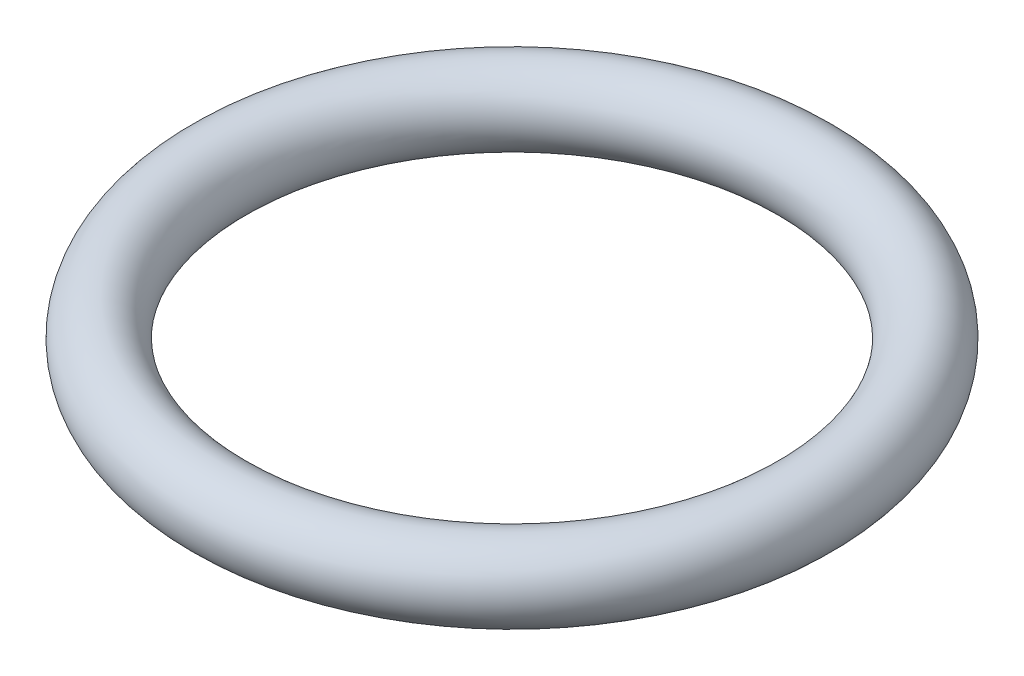
ISO-10303-21;
HEADER;
FILE_DESCRIPTION(('STEP AP214'),'2;1');
FILE_NAME('part.step','',(''),(''),'','','');
FILE_SCHEMA(('AUTOMOTIVE_DESIGN { 1 0 10303 214 1 1 1 1 }'));
ENDSEC;
DATA;
#1=APPLICATION_CONTEXT('core data for automotive mechanical design processes');
#2=APPLICATION_PROTOCOL_DEFINITION('international standard','automotive_design',2000,#1);
#3=PRODUCT_CONTEXT('',#1,'mechanical');
#4=PRODUCT('Part','Part','',(#3));
#5=PRODUCT_RELATED_PRODUCT_CATEGORY('part','',(#4));
#6=PRODUCT_DEFINITION_FORMATION('','',#4);
#7=PRODUCT_DEFINITION_CONTEXT('part definition',#1,'design');
#8=PRODUCT_DEFINITION('design','',#6,#7);
#9=PRODUCT_DEFINITION_SHAPE('','',#8);
#10=(LENGTH_UNIT() NAMED_UNIT(*) SI_UNIT(.MILLI.,.METRE.));
#11=(NAMED_UNIT(*) PLANE_ANGLE_UNIT() SI_UNIT($,.RADIAN.));
#12=(NAMED_UNIT(*) SI_UNIT($,.STERADIAN.) SOLID_ANGLE_UNIT());
#13=UNCERTAINTY_MEASURE_WITH_UNIT(LENGTH_MEASURE(1.E-05),#10,'distance_accuracy_value','');
#14=(GEOMETRIC_REPRESENTATION_CONTEXT(3) GLOBAL_UNCERTAINTY_ASSIGNED_CONTEXT((#13)) GLOBAL_UNIT_ASSIGNED_CONTEXT((#10,
#11,#12)) REPRESENTATION_CONTEXT('',''));
#15=CARTESIAN_POINT('',(0.,0.,0.));
#16=DIRECTION('',(0.,0.,1.));
#17=DIRECTION('',(1.,0.,0.));
#18=AXIS2_PLACEMENT_3D('',#15,#16,#17);
#19=CARTESIAN_POINT('',(0.,0.,0.));
#20=DIRECTION('',(0.,1.,0.));
#21=DIRECTION('',(0.,0.,1.));
#22=AXIS2_PLACEMENT_3D('',#19,#20,#21);
#23=TOROIDAL_SURFACE('',#22,12.446,1.5875);
#24=CARTESIAN_POINT('',(0.,0.,14.0335));
#25=VERTEX_POINT('',#24);
#26=VERTEX_LOOP('',#25);
#27=FACE_BOUND('',#26,.T.);
#28=ADVANCED_FACE('F28',(#27),#23,.T.);
#29=CLOSED_SHELL('',(#28));
#30=MANIFOLD_SOLID_BREP('B2',#29);
#31=ADVANCED_BREP_SHAPE_REPRESENTATION('',(#18,#30),#14);
#32=SHAPE_DEFINITION_REPRESENTATION(#9,#31);
ENDSEC;
END-ISO-10303-21;
